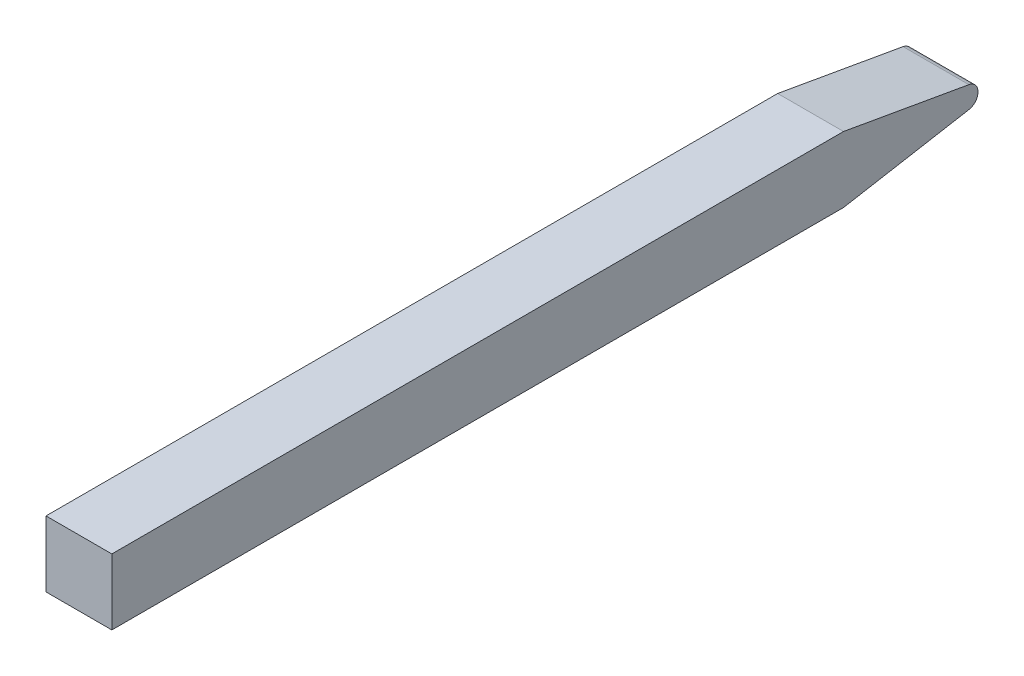
ISO-10303-21;
HEADER;
FILE_DESCRIPTION(('STEP AP214'),'2;1');
FILE_NAME('part.step','',(''),(''),'','','');
FILE_SCHEMA(('AUTOMOTIVE_DESIGN { 1 0 10303 214 1 1 1 1 }'));
ENDSEC;
DATA;
#1=APPLICATION_CONTEXT('core data for automotive mechanical design processes');
#2=APPLICATION_PROTOCOL_DEFINITION('international standard','automotive_design',2000,#1);
#3=PRODUCT_CONTEXT('',#1,'mechanical');
#4=PRODUCT('Part','Part','',(#3));
#5=PRODUCT_RELATED_PRODUCT_CATEGORY('part','',(#4));
#6=PRODUCT_DEFINITION_FORMATION('','',#4);
#7=PRODUCT_DEFINITION_CONTEXT('part definition',#1,'design');
#8=PRODUCT_DEFINITION('design','',#6,#7);
#9=PRODUCT_DEFINITION_SHAPE('','',#8);
#10=(LENGTH_UNIT() NAMED_UNIT(*) SI_UNIT(.MILLI.,.METRE.));
#11=(NAMED_UNIT(*) PLANE_ANGLE_UNIT() SI_UNIT($,.RADIAN.));
#12=(NAMED_UNIT(*) SI_UNIT($,.STERADIAN.) SOLID_ANGLE_UNIT());
#13=UNCERTAINTY_MEASURE_WITH_UNIT(LENGTH_MEASURE(1.E-05),#10,'distance_accuracy_value','');
#14=(GEOMETRIC_REPRESENTATION_CONTEXT(3) GLOBAL_UNCERTAINTY_ASSIGNED_CONTEXT((#13)) GLOBAL_UNIT_ASSIGNED_CONTEXT((#10,
#11,#12)) REPRESENTATION_CONTEXT('',''));
#15=CARTESIAN_POINT('',(0.,0.,0.));
#16=DIRECTION('',(0.,0.,1.));
#17=DIRECTION('',(1.,0.,0.));
#18=AXIS2_PLACEMENT_3D('',#15,#16,#17);
#19=CARTESIAN_POINT('',(0.45,0.,10.));
#20=DIRECTION('',(0.,1.,0.));
#21=DIRECTION('',(0.,0.,1.));
#22=AXIS2_PLACEMENT_3D('',#19,#20,#21);
#23=PLANE('',#22);
#24=DIRECTION('',(0.,0.,-1.));
#25=VECTOR('',#24,1.);
#26=CARTESIAN_POINT('',(-0.45,0.,10.));
#27=LINE('',#26,#25);
#28=CARTESIAN_POINT('',(-0.45,0.,10.));
#29=VERTEX_POINT('',#28);
#30=CARTESIAN_POINT('',(-0.45,0.,0.));
#31=VERTEX_POINT('',#30);
#32=EDGE_CURVE('E103',#29,#31,#27,.T.);
#33=ORIENTED_EDGE('',*,*,#32,.T.);
#34=DIRECTION('',(-1.,0.,0.));
#35=VECTOR('',#34,1.);
#36=CARTESIAN_POINT('',(0.45,0.,0.));
#37=LINE('',#36,#35);
#38=CARTESIAN_POINT('',(0.45,0.,0.));
#39=VERTEX_POINT('',#38);
#40=EDGE_CURVE('E86',#39,#31,#37,.T.);
#41=ORIENTED_EDGE('',*,*,#40,.F.);
#42=DIRECTION('',(0.,0.,-1.));
#43=VECTOR('',#42,1.);
#44=CARTESIAN_POINT('',(0.45,0.,10.));
#45=LINE('',#44,#43);
#46=CARTESIAN_POINT('',(0.45,0.,10.));
#47=VERTEX_POINT('',#46);
#48=EDGE_CURVE('E91',#47,#39,#45,.T.);
#49=ORIENTED_EDGE('',*,*,#48,.F.);
#50=DIRECTION('',(-1.,0.,0.));
#51=VECTOR('',#50,1.);
#52=CARTESIAN_POINT('',(0.45,0.,10.));
#53=LINE('',#52,#51);
#54=EDGE_CURVE('E116',#47,#29,#53,.T.);
#55=ORIENTED_EDGE('',*,*,#54,.T.);
#56=EDGE_LOOP('',(#33,#41,#49,#55));
#57=FACE_BOUND('',#56,.T.);
#58=ADVANCED_FACE('F33',(#57),#23,.F.);
#59=CARTESIAN_POINT('',(0.45,0.,0.));
#60=DIRECTION('',(0.,0.984807753012209,0.173648177666927));
#61=DIRECTION('',(0.,-0.173648177666927,0.984807753012209));
#62=AXIS2_PLACEMENT_3D('',#59,#60,#61);
#63=PLANE('',#62);
#64=DIRECTION('',(0.,0.173648177666927,-0.984807753012209));
#65=VECTOR('',#64,1.);
#66=CARTESIAN_POINT('',(-0.45,0.,0.));
#67=LINE('',#66,#65);
#68=CARTESIAN_POINT('',(-0.45,0.302278837048169,-1.7143084730065));
#69=VERTEX_POINT('',#68);
#70=EDGE_CURVE('E123',#31,#69,#67,.T.);
#71=ORIENTED_EDGE('',*,*,#70,.T.);
#72=DIRECTION('',(-1.,0.,0.));
#73=VECTOR('',#72,1.);
#74=CARTESIAN_POINT('',(0.45,0.302278837048169,-1.7143084730065));
#75=LINE('',#74,#73);
#76=CARTESIAN_POINT('',(0.45,0.302278837048169,-1.7143084730065));
#77=VERTEX_POINT('',#76);
#78=EDGE_CURVE('E41',#69,#77,#75,.F.);
#79=ORIENTED_EDGE('',*,*,#78,.T.);
#80=DIRECTION('',(0.,0.173648177666927,-0.984807753012209));
#81=VECTOR('',#80,1.);
#82=CARTESIAN_POINT('',(0.45,0.,0.));
#83=LINE('',#82,#81);
#84=EDGE_CURVE('E82',#39,#77,#83,.T.);
#85=ORIENTED_EDGE('',*,*,#84,.F.);
#86=ORIENTED_EDGE('',*,*,#40,.T.);
#87=EDGE_LOOP('',(#71,#79,#85,#86));
#88=FACE_BOUND('',#87,.T.);
#89=ADVANCED_FACE('F84',(#88),#63,.F.);
#90=CARTESIAN_POINT('',(0.45,0.450000000000001,-2.55207681882802));
#91=DIRECTION('',(0.,-0.984807753012209,0.173648177666927));
#92=DIRECTION('',(0.,-0.173648177666927,-0.984807753012209));
#93=AXIS2_PLACEMENT_3D('',#90,#91,#92);
#94=PLANE('',#93);
#95=DIRECTION('',(0.,0.173648177666927,0.984807753012209));
#96=VECTOR('',#95,1.);
#97=CARTESIAN_POINT('',(0.45,0.450000000000001,-2.55207681882802));
#98=LINE('',#97,#96);
#99=CARTESIAN_POINT('',(0.45,0.597721162951832,-1.7143084730065));
#100=VERTEX_POINT('',#99);
#101=CARTESIAN_POINT('',(0.45,0.9,0.));
#102=VERTEX_POINT('',#101);
#103=EDGE_CURVE('E90',#100,#102,#98,.T.);
#104=ORIENTED_EDGE('',*,*,#103,.F.);
#105=DIRECTION('',(-1.,0.,0.));
#106=VECTOR('',#105,1.);
#107=CARTESIAN_POINT('',(0.45,0.597721162951832,-1.7143084730065));
#108=LINE('',#107,#106);
#109=CARTESIAN_POINT('',(-0.45,0.597721162951832,-1.7143084730065));
#110=VERTEX_POINT('',#109);
#111=EDGE_CURVE('E104',#100,#110,#108,.T.);
#112=ORIENTED_EDGE('',*,*,#111,.T.);
#113=DIRECTION('',(0.,0.173648177666927,0.984807753012209));
#114=VECTOR('',#113,1.);
#115=CARTESIAN_POINT('',(-0.45,0.450000000000001,-2.55207681882802));
#116=LINE('',#115,#114);
#117=CARTESIAN_POINT('',(-0.45,0.9,0.));
#118=VERTEX_POINT('',#117);
#119=EDGE_CURVE('E121',#110,#118,#116,.T.);
#120=ORIENTED_EDGE('',*,*,#119,.T.);
#121=DIRECTION('',(-1.,0.,0.));
#122=VECTOR('',#121,1.);
#123=CARTESIAN_POINT('',(0.45,0.9,0.));
#124=LINE('',#123,#122);
#125=EDGE_CURVE('E105',#102,#118,#124,.T.);
#126=ORIENTED_EDGE('',*,*,#125,.F.);
#127=EDGE_LOOP('',(#104,#112,#120,#126));
#128=FACE_BOUND('',#127,.T.);
#129=ADVANCED_FACE('F135',(#128),#94,.F.);
#130=CARTESIAN_POINT('',(0.45,0.9,0.));
#131=DIRECTION('',(0.,-1.,0.));
#132=DIRECTION('',(0.,0.,-1.));
#133=AXIS2_PLACEMENT_3D('',#130,#131,#132);
#134=PLANE('',#133);
#135=DIRECTION('',(0.,0.,1.));
#136=VECTOR('',#135,1.);
#137=CARTESIAN_POINT('',(-0.45,0.9,0.));
#138=LINE('',#137,#136);
#139=CARTESIAN_POINT('',(-0.45,0.899999999999999,10.));
#140=VERTEX_POINT('',#139);
#141=EDGE_CURVE('E119',#118,#140,#138,.T.);
#142=ORIENTED_EDGE('',*,*,#141,.T.);
#143=DIRECTION('',(-1.,0.,0.));
#144=VECTOR('',#143,1.);
#145=CARTESIAN_POINT('',(0.45,0.899999999999999,10.));
#146=LINE('',#145,#144);
#147=CARTESIAN_POINT('',(0.45,0.899999999999999,10.));
#148=VERTEX_POINT('',#147);
#149=EDGE_CURVE('E110',#148,#140,#146,.T.);
#150=ORIENTED_EDGE('',*,*,#149,.F.);
#151=DIRECTION('',(0.,0.,1.));
#152=VECTOR('',#151,1.);
#153=CARTESIAN_POINT('',(0.45,0.9,0.));
#154=LINE('',#153,#152);
#155=EDGE_CURVE('E127',#102,#148,#154,.T.);
#156=ORIENTED_EDGE('',*,*,#155,.F.);
#157=ORIENTED_EDGE('',*,*,#125,.T.);
#158=EDGE_LOOP('',(#142,#150,#156,#157));
#159=FACE_BOUND('',#158,.T.);
#160=ADVANCED_FACE('F138',(#159),#134,.F.);
#161=CARTESIAN_POINT('',(0.45,0.899999999999999,10.));
#162=DIRECTION('',(0.,0.,-1.));
#163=DIRECTION('',(-1.,0.,0.));
#164=AXIS2_PLACEMENT_3D('',#161,#162,#163);
#165=PLANE('',#164);
#166=DIRECTION('',(0.,-1.,0.));
#167=VECTOR('',#166,1.);
#168=CARTESIAN_POINT('',(-0.45,0.899999999999999,10.));
#169=LINE('',#168,#167);
#170=EDGE_CURVE('E100',#140,#29,#169,.T.);
#171=ORIENTED_EDGE('',*,*,#170,.T.);
#172=ORIENTED_EDGE('',*,*,#54,.F.);
#173=DIRECTION('',(0.,-1.,0.));
#174=VECTOR('',#173,1.);
#175=CARTESIAN_POINT('',(0.45,0.899999999999999,10.));
#176=LINE('',#175,#174);
#177=EDGE_CURVE('E96',#148,#47,#176,.T.);
#178=ORIENTED_EDGE('',*,*,#177,.F.);
#179=ORIENTED_EDGE('',*,*,#149,.T.);
#180=EDGE_LOOP('',(#171,#172,#178,#179));
#181=FACE_BOUND('',#180,.T.);
#182=ADVANCED_FACE('F141',(#181),#165,.F.);
#183=CARTESIAN_POINT('',(0.45,0.,0.));
#184=DIRECTION('',(-1.,0.,0.));
#185=DIRECTION('',(0.,0.,1.));
#186=AXIS2_PLACEMENT_3D('',#183,#184,#185);
#187=PLANE('',#186);
#188=ORIENTED_EDGE('',*,*,#84,.T.);
#189=CARTESIAN_POINT('',(0.45,0.45,-1.68826124635646));
#190=DIRECTION('',(-1.,0.,0.));
#191=DIRECTION('',(0.,0.,1.));
#192=AXIS2_PLACEMENT_3D('',#189,#190,#191);
#193=CIRCLE('',#192,0.15);
#194=EDGE_CURVE('E11',#77,#100,#193,.F.);
#195=ORIENTED_EDGE('',*,*,#194,.T.);
#196=ORIENTED_EDGE('',*,*,#103,.T.);
#197=ORIENTED_EDGE('',*,*,#155,.T.);
#198=ORIENTED_EDGE('',*,*,#177,.T.);
#199=ORIENTED_EDGE('',*,*,#48,.T.);
#200=EDGE_LOOP('',(#188,#195,#196,#197,#198,#199));
#201=FACE_BOUND('',#200,.T.);
#202=ADVANCED_FACE('F94',(#201),#187,.F.);
#203=CARTESIAN_POINT('',(-0.45,0.,0.));
#204=DIRECTION('',(-1.,0.,0.));
#205=DIRECTION('',(0.,0.,1.));
#206=AXIS2_PLACEMENT_3D('',#203,#204,#205);
#207=PLANE('',#206);
#208=ORIENTED_EDGE('',*,*,#119,.F.);
#209=CARTESIAN_POINT('',(-0.45,0.45,-1.68826124635646));
#210=DIRECTION('',(-1.,0.,0.));
#211=DIRECTION('',(0.,0.,1.));
#212=AXIS2_PLACEMENT_3D('',#209,#210,#211);
#213=CIRCLE('',#212,0.15);
#214=EDGE_CURVE('E55',#110,#69,#213,.T.);
#215=ORIENTED_EDGE('',*,*,#214,.T.);
#216=ORIENTED_EDGE('',*,*,#70,.F.);
#217=ORIENTED_EDGE('',*,*,#32,.F.);
#218=ORIENTED_EDGE('',*,*,#170,.F.);
#219=ORIENTED_EDGE('',*,*,#141,.F.);
#220=EDGE_LOOP('',(#208,#215,#216,#217,#218,#219));
#221=FACE_BOUND('',#220,.T.);
#222=ADVANCED_FACE('F142',(#221),#207,.T.);
#223=CARTESIAN_POINT('',(0.45,0.45,-1.68826124635646));
#224=DIRECTION('',(-1.,0.,0.));
#225=DIRECTION('',(0.,0.,1.));
#226=AXIS2_PLACEMENT_3D('',#223,#224,#225);
#227=CYLINDRICAL_SURFACE('',#226,0.15);
#228=ORIENTED_EDGE('',*,*,#194,.F.);
#229=ORIENTED_EDGE('',*,*,#78,.F.);
#230=ORIENTED_EDGE('',*,*,#214,.F.);
#231=ORIENTED_EDGE('',*,*,#111,.F.);
#232=EDGE_LOOP('',(#228,#229,#230,#231));
#233=FACE_BOUND('',#232,.T.);
#234=ADVANCED_FACE('F35',(#233),#227,.T.);
#235=CLOSED_SHELL('',(#58,#89,#129,#160,#182,#202,#222,#234));
#236=MANIFOLD_SOLID_BREP('B2',#235);
#237=ADVANCED_BREP_SHAPE_REPRESENTATION('',(#18,#236),#14);
#238=SHAPE_DEFINITION_REPRESENTATION(#9,#237);
ENDSEC;
END-ISO-10303-21;
